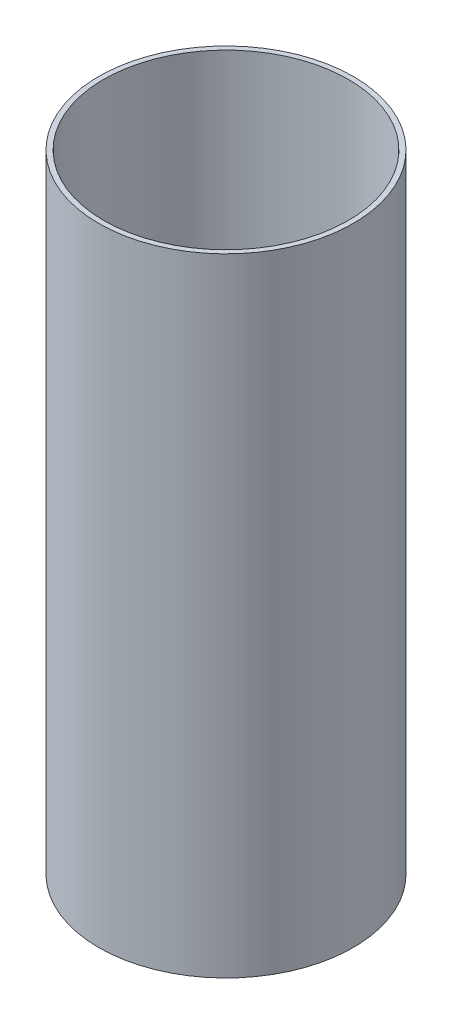
ISO-10303-21;
HEADER;
FILE_DESCRIPTION(('STEP AP214'),'2;1');
FILE_NAME('part.step','',(''),(''),'','','');
FILE_SCHEMA(('AUTOMOTIVE_DESIGN { 1 0 10303 214 1 1 1 1 }'));
ENDSEC;
DATA;
#1=APPLICATION_CONTEXT('core data for automotive mechanical design processes');
#2=APPLICATION_PROTOCOL_DEFINITION('international standard','automotive_design',2000,#1);
#3=PRODUCT_CONTEXT('',#1,'mechanical');
#4=PRODUCT('Part','Part','',(#3));
#5=PRODUCT_RELATED_PRODUCT_CATEGORY('part','',(#4));
#6=PRODUCT_DEFINITION_FORMATION('','',#4);
#7=PRODUCT_DEFINITION_CONTEXT('part definition',#1,'design');
#8=PRODUCT_DEFINITION('design','',#6,#7);
#9=PRODUCT_DEFINITION_SHAPE('','',#8);
#10=(LENGTH_UNIT() NAMED_UNIT(*) SI_UNIT(.MILLI.,.METRE.));
#11=(NAMED_UNIT(*) PLANE_ANGLE_UNIT() SI_UNIT($,.RADIAN.));
#12=(NAMED_UNIT(*) SI_UNIT($,.STERADIAN.) SOLID_ANGLE_UNIT());
#13=UNCERTAINTY_MEASURE_WITH_UNIT(LENGTH_MEASURE(1.E-05),#10,'distance_accuracy_value','');
#14=(GEOMETRIC_REPRESENTATION_CONTEXT(3) GLOBAL_UNCERTAINTY_ASSIGNED_CONTEXT((#13)) GLOBAL_UNIT_ASSIGNED_CONTEXT((#10,
#11,#12)) REPRESENTATION_CONTEXT('',''));
#15=CARTESIAN_POINT('',(0.,0.,0.));
#16=DIRECTION('',(0.,0.,1.));
#17=DIRECTION('',(1.,0.,0.));
#18=AXIS2_PLACEMENT_3D('',#15,#16,#17);
#19=CARTESIAN_POINT('',(0.,254.,0.));
#20=DIRECTION('',(0.,1.,0.));
#21=DIRECTION('',(0.,0.,1.));
#22=AXIS2_PLACEMENT_3D('',#19,#20,#21);
#23=PLANE('',#22);
#24=CARTESIAN_POINT('',(0.,254.,0.));
#25=DIRECTION('',(0.,1.,0.));
#26=DIRECTION('',(0.,0.,1.));
#27=AXIS2_PLACEMENT_3D('',#24,#25,#26);
#28=CIRCLE('',#27,51.562);
#29=CARTESIAN_POINT('',(0.,254.,51.562));
#30=VERTEX_POINT('',#29);
#31=EDGE_CURVE('E10',#30,#30,#28,.T.);
#32=ORIENTED_EDGE('',*,*,#31,.T.);
#33=EDGE_LOOP('',(#32));
#34=FACE_BOUND('',#33,.T.);
#35=CARTESIAN_POINT('',(0.,254.,0.));
#36=DIRECTION('',(0.,1.,0.));
#37=DIRECTION('',(0.,0.,1.));
#38=AXIS2_PLACEMENT_3D('',#35,#36,#37);
#39=CIRCLE('',#38,49.53);
#40=CARTESIAN_POINT('',(0.,254.,49.53));
#41=VERTEX_POINT('',#40);
#42=EDGE_CURVE('E44',#41,#41,#39,.T.);
#43=ORIENTED_EDGE('',*,*,#42,.F.);
#44=EDGE_LOOP('',(#43));
#45=FACE_BOUND('',#44,.T.);
#46=ADVANCED_FACE('F33',(#34,#45),#23,.T.);
#47=CARTESIAN_POINT('',(0.,0.,0.));
#48=DIRECTION('',(0.,1.,0.));
#49=DIRECTION('',(0.,0.,1.));
#50=AXIS2_PLACEMENT_3D('',#47,#48,#49);
#51=PLANE('',#50);
#52=CARTESIAN_POINT('',(0.,0.,0.));
#53=DIRECTION('',(0.,1.,0.));
#54=DIRECTION('',(0.,0.,1.));
#55=AXIS2_PLACEMENT_3D('',#52,#53,#54);
#56=CIRCLE('',#55,51.562);
#57=CARTESIAN_POINT('',(0.,0.,51.562));
#58=VERTEX_POINT('',#57);
#59=EDGE_CURVE('E37',#58,#58,#56,.T.);
#60=ORIENTED_EDGE('',*,*,#59,.F.);
#61=EDGE_LOOP('',(#60));
#62=FACE_BOUND('',#61,.T.);
#63=CARTESIAN_POINT('',(0.,0.,0.));
#64=DIRECTION('',(0.,1.,0.));
#65=DIRECTION('',(0.,0.,1.));
#66=AXIS2_PLACEMENT_3D('',#63,#64,#65);
#67=CIRCLE('',#66,49.53);
#68=CARTESIAN_POINT('',(0.,0.,49.53));
#69=VERTEX_POINT('',#68);
#70=EDGE_CURVE('E46',#69,#69,#67,.T.);
#71=ORIENTED_EDGE('',*,*,#70,.T.);
#72=EDGE_LOOP('',(#71));
#73=FACE_BOUND('',#72,.T.);
#74=ADVANCED_FACE('F56',(#62,#73),#51,.F.);
#75=CARTESIAN_POINT('',(0.,254.,0.));
#76=DIRECTION('',(0.,-1.,0.));
#77=DIRECTION('',(0.,0.,-1.));
#78=AXIS2_PLACEMENT_3D('',#75,#76,#77);
#79=CYLINDRICAL_SURFACE('',#78,51.562);
#80=ORIENTED_EDGE('',*,*,#31,.F.);
#81=EDGE_LOOP('',(#80));
#82=FACE_BOUND('',#81,.T.);
#83=ORIENTED_EDGE('',*,*,#59,.T.);
#84=EDGE_LOOP('',(#83));
#85=FACE_BOUND('',#84,.T.);
#86=ADVANCED_FACE('F35',(#82,#85),#79,.T.);
#87=CARTESIAN_POINT('',(0.,254.,0.));
#88=DIRECTION('',(0.,-1.,0.));
#89=DIRECTION('',(0.,0.,-1.));
#90=AXIS2_PLACEMENT_3D('',#87,#88,#89);
#91=CYLINDRICAL_SURFACE('',#90,49.53);
#92=ORIENTED_EDGE('',*,*,#42,.T.);
#93=EDGE_LOOP('',(#92));
#94=FACE_BOUND('',#93,.T.);
#95=ORIENTED_EDGE('',*,*,#70,.F.);
#96=EDGE_LOOP('',(#95));
#97=FACE_BOUND('',#96,.T.);
#98=ADVANCED_FACE('F52',(#94,#97),#91,.F.);
#99=CLOSED_SHELL('',(#46,#74,#86,#98));
#100=MANIFOLD_SOLID_BREP('B2',#99);
#101=ADVANCED_BREP_SHAPE_REPRESENTATION('',(#18,#100),#14);
#102=SHAPE_DEFINITION_REPRESENTATION(#9,#101);
ENDSEC;
END-ISO-10303-21;
